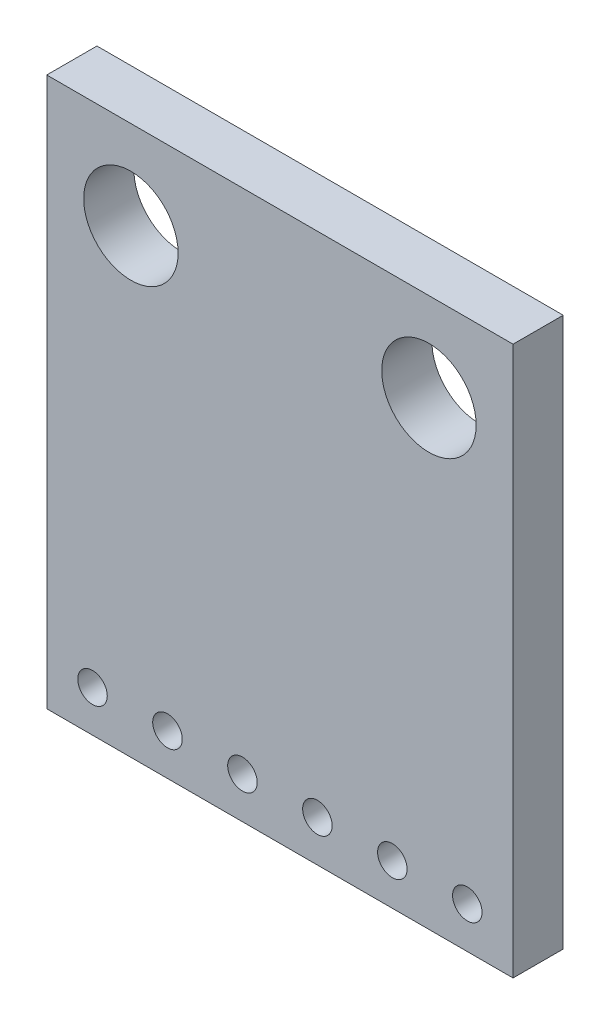
ISO-10303-21;
HEADER;
FILE_DESCRIPTION(('STEP AP214'),'2;1');
FILE_NAME('part.step','',(''),(''),'','','');
FILE_SCHEMA(('AUTOMOTIVE_DESIGN { 1 0 10303 214 1 1 1 1 }'));
ENDSEC;
DATA;
#1=APPLICATION_CONTEXT('core data for automotive mechanical design processes');
#2=APPLICATION_PROTOCOL_DEFINITION('international standard','automotive_design',2000,#1);
#3=PRODUCT_CONTEXT('',#1,'mechanical');
#4=PRODUCT('Part','Part','',(#3));
#5=PRODUCT_RELATED_PRODUCT_CATEGORY('part','',(#4));
#6=PRODUCT_DEFINITION_FORMATION('','',#4);
#7=PRODUCT_DEFINITION_CONTEXT('part definition',#1,'design');
#8=PRODUCT_DEFINITION('design','',#6,#7);
#9=PRODUCT_DEFINITION_SHAPE('','',#8);
#10=(LENGTH_UNIT() NAMED_UNIT(*) SI_UNIT(.MILLI.,.METRE.));
#11=(NAMED_UNIT(*) PLANE_ANGLE_UNIT() SI_UNIT($,.RADIAN.));
#12=(NAMED_UNIT(*) SI_UNIT($,.STERADIAN.) SOLID_ANGLE_UNIT());
#13=UNCERTAINTY_MEASURE_WITH_UNIT(LENGTH_MEASURE(1.E-05),#10,'distance_accuracy_value','');
#14=(GEOMETRIC_REPRESENTATION_CONTEXT(3) GLOBAL_UNCERTAINTY_ASSIGNED_CONTEXT((#13)) GLOBAL_UNIT_ASSIGNED_CONTEXT((#10,
#11,#12)) REPRESENTATION_CONTEXT('',''));
#15=CARTESIAN_POINT('',(0.,0.,0.));
#16=DIRECTION('',(0.,0.,1.));
#17=DIRECTION('',(1.,0.,0.));
#18=AXIS2_PLACEMENT_3D('',#15,#16,#17);
#19=CARTESIAN_POINT('',(0.,0.,1.7));
#20=DIRECTION('',(0.,0.,1.));
#21=DIRECTION('',(1.,0.,0.));
#22=AXIS2_PLACEMENT_3D('',#19,#20,#21);
#23=PLANE('',#22);
#24=CARTESIAN_POINT('',(3.81,-7.9,1.7));
#25=DIRECTION('',(0.,0.,1.));
#26=DIRECTION('',(1.,0.,0.));
#27=AXIS2_PLACEMENT_3D('',#24,#25,#26);
#28=CIRCLE('',#27,0.500000000000001);
#29=CARTESIAN_POINT('',(4.31,-7.9,1.7));
#30=VERTEX_POINT('',#29);
#31=EDGE_CURVE('E151',#30,#30,#28,.T.);
#32=ORIENTED_EDGE('',*,*,#31,.F.);
#33=EDGE_LOOP('',(#32));
#34=FACE_BOUND('',#33,.T.);
#35=CARTESIAN_POINT('',(-1.27,-7.9,1.7));
#36=DIRECTION('',(0.,0.,1.));
#37=DIRECTION('',(1.,0.,0.));
#38=AXIS2_PLACEMENT_3D('',#35,#36,#37);
#39=CIRCLE('',#38,0.500000000000001);
#40=CARTESIAN_POINT('',(-0.769999999999999,-7.9,1.7));
#41=VERTEX_POINT('',#40);
#42=EDGE_CURVE('E139',#41,#41,#39,.T.);
#43=ORIENTED_EDGE('',*,*,#42,.F.);
#44=EDGE_LOOP('',(#43));
#45=FACE_BOUND('',#44,.T.);
#46=CARTESIAN_POINT('',(-6.35,-7.9,1.7));
#47=DIRECTION('',(0.,0.,1.));
#48=DIRECTION('',(1.,0.,0.));
#49=AXIS2_PLACEMENT_3D('',#46,#47,#48);
#50=CIRCLE('',#49,0.500000000000001);
#51=CARTESIAN_POINT('',(-5.85,-7.9,1.7));
#52=VERTEX_POINT('',#51);
#53=EDGE_CURVE('E127',#52,#52,#50,.T.);
#54=ORIENTED_EDGE('',*,*,#53,.F.);
#55=EDGE_LOOP('',(#54));
#56=FACE_BOUND('',#55,.T.);
#57=CARTESIAN_POINT('',(-5.05,6.3,1.7));
#58=DIRECTION('',(0.,0.,1.));
#59=DIRECTION('',(1.,0.,0.));
#60=AXIS2_PLACEMENT_3D('',#57,#58,#59);
#61=CIRCLE('',#60,1.6);
#62=CARTESIAN_POINT('',(-3.45,6.3,1.7));
#63=VERTEX_POINT('',#62);
#64=EDGE_CURVE('E106',#63,#63,#61,.T.);
#65=ORIENTED_EDGE('',*,*,#64,.F.);
#66=EDGE_LOOP('',(#65));
#67=FACE_BOUND('',#66,.T.);
#68=DIRECTION('',(0.,1.,0.));
#69=VECTOR('',#68,1.);
#70=CARTESIAN_POINT('',(7.9,9.3,1.7));
#71=LINE('',#70,#69);
#72=CARTESIAN_POINT('',(7.9,-9.3,1.7));
#73=VERTEX_POINT('',#72);
#74=CARTESIAN_POINT('',(7.9,9.3,1.7));
#75=VERTEX_POINT('',#74);
#76=EDGE_CURVE('E91',#73,#75,#71,.T.);
#77=ORIENTED_EDGE('',*,*,#76,.T.);
#78=DIRECTION('',(-1.,0.,0.));
#79=VECTOR('',#78,1.);
#80=CARTESIAN_POINT('',(-7.9,9.3,1.7));
#81=LINE('',#80,#79);
#82=CARTESIAN_POINT('',(-7.9,9.3,1.7));
#83=VERTEX_POINT('',#82);
#84=EDGE_CURVE('E86',#75,#83,#81,.T.);
#85=ORIENTED_EDGE('',*,*,#84,.T.);
#86=DIRECTION('',(0.,-1.,0.));
#87=VECTOR('',#86,1.);
#88=CARTESIAN_POINT('',(-7.9,9.3,1.7));
#89=LINE('',#88,#87);
#90=CARTESIAN_POINT('',(-7.9,-9.3,1.7));
#91=VERTEX_POINT('',#90);
#92=EDGE_CURVE('E89',#83,#91,#89,.T.);
#93=ORIENTED_EDGE('',*,*,#92,.T.);
#94=DIRECTION('',(1.,0.,0.));
#95=VECTOR('',#94,1.);
#96=CARTESIAN_POINT('',(-7.9,-9.3,1.7));
#97=LINE('',#96,#95);
#98=EDGE_CURVE('E56',#91,#73,#97,.T.);
#99=ORIENTED_EDGE('',*,*,#98,.T.);
#100=EDGE_LOOP('',(#77,#85,#93,#99));
#101=FACE_BOUND('',#100,.T.);
#102=CARTESIAN_POINT('',(5.05,6.3,1.7));
#103=DIRECTION('',(0.,0.,1.));
#104=DIRECTION('',(1.,0.,0.));
#105=AXIS2_PLACEMENT_3D('',#102,#103,#104);
#106=CIRCLE('',#105,1.6);
#107=CARTESIAN_POINT('',(6.65,6.3,1.7));
#108=VERTEX_POINT('',#107);
#109=EDGE_CURVE('E121',#108,#108,#106,.T.);
#110=ORIENTED_EDGE('',*,*,#109,.F.);
#111=EDGE_LOOP('',(#110));
#112=FACE_BOUND('',#111,.T.);
#113=CARTESIAN_POINT('',(-3.81,-7.9,1.7));
#114=DIRECTION('',(0.,0.,1.));
#115=DIRECTION('',(1.,0.,0.));
#116=AXIS2_PLACEMENT_3D('',#113,#114,#115);
#117=CIRCLE('',#116,0.500000000000001);
#118=CARTESIAN_POINT('',(-3.31,-7.9,1.7));
#119=VERTEX_POINT('',#118);
#120=EDGE_CURVE('E133',#119,#119,#117,.T.);
#121=ORIENTED_EDGE('',*,*,#120,.F.);
#122=EDGE_LOOP('',(#121));
#123=FACE_BOUND('',#122,.T.);
#124=CARTESIAN_POINT('',(1.27,-7.9,1.7));
#125=DIRECTION('',(0.,0.,1.));
#126=DIRECTION('',(1.,0.,0.));
#127=AXIS2_PLACEMENT_3D('',#124,#125,#126);
#128=CIRCLE('',#127,0.500000000000001);
#129=CARTESIAN_POINT('',(1.77,-7.9,1.7));
#130=VERTEX_POINT('',#129);
#131=EDGE_CURVE('E145',#130,#130,#128,.T.);
#132=ORIENTED_EDGE('',*,*,#131,.F.);
#133=EDGE_LOOP('',(#132));
#134=FACE_BOUND('',#133,.T.);
#135=CARTESIAN_POINT('',(6.35,-7.9,1.7));
#136=DIRECTION('',(0.,0.,1.));
#137=DIRECTION('',(1.,0.,0.));
#138=AXIS2_PLACEMENT_3D('',#135,#136,#137);
#139=CIRCLE('',#138,0.500000000000001);
#140=CARTESIAN_POINT('',(6.85,-7.9,1.7));
#141=VERTEX_POINT('',#140);
#142=EDGE_CURVE('E157',#141,#141,#139,.T.);
#143=ORIENTED_EDGE('',*,*,#142,.F.);
#144=EDGE_LOOP('',(#143));
#145=FACE_BOUND('',#144,.T.);
#146=ADVANCED_FACE('F39',(#34,#45,#56,#67,#101,#112,#123,#134,#145),#23,.T.);
#147=CARTESIAN_POINT('',(0.,0.,0.));
#148=DIRECTION('',(0.,0.,1.));
#149=DIRECTION('',(1.,0.,0.));
#150=AXIS2_PLACEMENT_3D('',#147,#148,#149);
#151=PLANE('',#150);
#152=DIRECTION('',(0.,1.,0.));
#153=VECTOR('',#152,1.);
#154=CARTESIAN_POINT('',(7.9,9.3,0.));
#155=LINE('',#154,#153);
#156=CARTESIAN_POINT('',(7.9,-9.3,0.));
#157=VERTEX_POINT('',#156);
#158=CARTESIAN_POINT('',(7.9,9.3,0.));
#159=VERTEX_POINT('',#158);
#160=EDGE_CURVE('E103',#157,#159,#155,.T.);
#161=ORIENTED_EDGE('',*,*,#160,.F.);
#162=DIRECTION('',(1.,0.,0.));
#163=VECTOR('',#162,1.);
#164=CARTESIAN_POINT('',(-7.9,-9.3,0.));
#165=LINE('',#164,#163);
#166=CARTESIAN_POINT('',(-7.9,-9.3,0.));
#167=VERTEX_POINT('',#166);
#168=EDGE_CURVE('E79',#167,#157,#165,.T.);
#169=ORIENTED_EDGE('',*,*,#168,.F.);
#170=DIRECTION('',(0.,-1.,0.));
#171=VECTOR('',#170,1.);
#172=CARTESIAN_POINT('',(-7.9,9.3,0.));
#173=LINE('',#172,#171);
#174=CARTESIAN_POINT('',(-7.9,9.3,0.));
#175=VERTEX_POINT('',#174);
#176=EDGE_CURVE('E73',#175,#167,#173,.T.);
#177=ORIENTED_EDGE('',*,*,#176,.F.);
#178=DIRECTION('',(-1.,0.,0.));
#179=VECTOR('',#178,1.);
#180=CARTESIAN_POINT('',(-7.9,9.3,0.));
#181=LINE('',#180,#179);
#182=EDGE_CURVE('E95',#159,#175,#181,.T.);
#183=ORIENTED_EDGE('',*,*,#182,.F.);
#184=EDGE_LOOP('',(#161,#169,#177,#183));
#185=FACE_BOUND('',#184,.T.);
#186=CARTESIAN_POINT('',(-5.05,6.3,0.));
#187=DIRECTION('',(0.,0.,1.));
#188=DIRECTION('',(1.,0.,0.));
#189=AXIS2_PLACEMENT_3D('',#186,#187,#188);
#190=CIRCLE('',#189,1.6);
#191=CARTESIAN_POINT('',(-3.45,6.3,0.));
#192=VERTEX_POINT('',#191);
#193=EDGE_CURVE('E118',#192,#192,#190,.T.);
#194=ORIENTED_EDGE('',*,*,#193,.T.);
#195=EDGE_LOOP('',(#194));
#196=FACE_BOUND('',#195,.T.);
#197=CARTESIAN_POINT('',(5.05,6.3,0.));
#198=DIRECTION('',(0.,0.,1.));
#199=DIRECTION('',(1.,0.,0.));
#200=AXIS2_PLACEMENT_3D('',#197,#198,#199);
#201=CIRCLE('',#200,1.6);
#202=CARTESIAN_POINT('',(6.65,6.3,0.));
#203=VERTEX_POINT('',#202);
#204=EDGE_CURVE('E124',#203,#203,#201,.T.);
#205=ORIENTED_EDGE('',*,*,#204,.T.);
#206=EDGE_LOOP('',(#205));
#207=FACE_BOUND('',#206,.T.);
#208=CARTESIAN_POINT('',(-6.35,-7.9,0.));
#209=DIRECTION('',(0.,0.,1.));
#210=DIRECTION('',(1.,0.,0.));
#211=AXIS2_PLACEMENT_3D('',#208,#209,#210);
#212=CIRCLE('',#211,0.500000000000001);
#213=CARTESIAN_POINT('',(-5.85,-7.9,0.));
#214=VERTEX_POINT('',#213);
#215=EDGE_CURVE('E130',#214,#214,#212,.T.);
#216=ORIENTED_EDGE('',*,*,#215,.T.);
#217=EDGE_LOOP('',(#216));
#218=FACE_BOUND('',#217,.T.);
#219=CARTESIAN_POINT('',(-3.81,-7.9,0.));
#220=DIRECTION('',(0.,0.,1.));
#221=DIRECTION('',(1.,0.,0.));
#222=AXIS2_PLACEMENT_3D('',#219,#220,#221);
#223=CIRCLE('',#222,0.500000000000001);
#224=CARTESIAN_POINT('',(-3.31,-7.9,0.));
#225=VERTEX_POINT('',#224);
#226=EDGE_CURVE('E136',#225,#225,#223,.T.);
#227=ORIENTED_EDGE('',*,*,#226,.T.);
#228=EDGE_LOOP('',(#227));
#229=FACE_BOUND('',#228,.T.);
#230=CARTESIAN_POINT('',(-1.27,-7.9,0.));
#231=DIRECTION('',(0.,0.,1.));
#232=DIRECTION('',(1.,0.,0.));
#233=AXIS2_PLACEMENT_3D('',#230,#231,#232);
#234=CIRCLE('',#233,0.500000000000001);
#235=CARTESIAN_POINT('',(-0.769999999999999,-7.9,0.));
#236=VERTEX_POINT('',#235);
#237=EDGE_CURVE('E142',#236,#236,#234,.T.);
#238=ORIENTED_EDGE('',*,*,#237,.T.);
#239=EDGE_LOOP('',(#238));
#240=FACE_BOUND('',#239,.T.);
#241=CARTESIAN_POINT('',(1.27,-7.9,0.));
#242=DIRECTION('',(0.,0.,1.));
#243=DIRECTION('',(1.,0.,0.));
#244=AXIS2_PLACEMENT_3D('',#241,#242,#243);
#245=CIRCLE('',#244,0.500000000000001);
#246=CARTESIAN_POINT('',(1.77,-7.9,0.));
#247=VERTEX_POINT('',#246);
#248=EDGE_CURVE('E148',#247,#247,#245,.T.);
#249=ORIENTED_EDGE('',*,*,#248,.T.);
#250=EDGE_LOOP('',(#249));
#251=FACE_BOUND('',#250,.T.);
#252=CARTESIAN_POINT('',(3.81,-7.9,0.));
#253=DIRECTION('',(0.,0.,1.));
#254=DIRECTION('',(1.,0.,0.));
#255=AXIS2_PLACEMENT_3D('',#252,#253,#254);
#256=CIRCLE('',#255,0.500000000000001);
#257=CARTESIAN_POINT('',(4.31,-7.9,0.));
#258=VERTEX_POINT('',#257);
#259=EDGE_CURVE('E154',#258,#258,#256,.T.);
#260=ORIENTED_EDGE('',*,*,#259,.T.);
#261=EDGE_LOOP('',(#260));
#262=FACE_BOUND('',#261,.T.);
#263=CARTESIAN_POINT('',(6.35,-7.9,0.));
#264=DIRECTION('',(0.,0.,1.));
#265=DIRECTION('',(1.,0.,0.));
#266=AXIS2_PLACEMENT_3D('',#263,#264,#265);
#267=CIRCLE('',#266,0.500000000000001);
#268=CARTESIAN_POINT('',(6.85,-7.9,0.));
#269=VERTEX_POINT('',#268);
#270=EDGE_CURVE('E160',#269,#269,#267,.T.);
#271=ORIENTED_EDGE('',*,*,#270,.T.);
#272=EDGE_LOOP('',(#271));
#273=FACE_BOUND('',#272,.T.);
#274=ADVANCED_FACE('F114',(#185,#196,#207,#218,#229,#240,#251,#262,#273),#151,.F.);
#275=CARTESIAN_POINT('',(7.9,9.3,1.7));
#276=DIRECTION('',(-1.,0.,0.));
#277=DIRECTION('',(0.,0.,1.));
#278=AXIS2_PLACEMENT_3D('',#275,#276,#277);
#279=PLANE('',#278);
#280=ORIENTED_EDGE('',*,*,#160,.T.);
#281=DIRECTION('',(0.,0.,-1.));
#282=VECTOR('',#281,1.);
#283=CARTESIAN_POINT('',(7.9,9.3,1.7));
#284=LINE('',#283,#282);
#285=EDGE_CURVE('E11',#75,#159,#284,.T.);
#286=ORIENTED_EDGE('',*,*,#285,.F.);
#287=ORIENTED_EDGE('',*,*,#76,.F.);
#288=DIRECTION('',(0.,0.,-1.));
#289=VECTOR('',#288,1.);
#290=CARTESIAN_POINT('',(7.9,-9.3,1.7));
#291=LINE('',#290,#289);
#292=EDGE_CURVE('E99',#73,#157,#291,.T.);
#293=ORIENTED_EDGE('',*,*,#292,.T.);
#294=EDGE_LOOP('',(#280,#286,#287,#293));
#295=FACE_BOUND('',#294,.T.);
#296=ADVANCED_FACE('F41',(#295),#279,.F.);
#297=CARTESIAN_POINT('',(-7.9,9.3,1.7));
#298=DIRECTION('',(0.,-1.,0.));
#299=DIRECTION('',(0.,0.,-1.));
#300=AXIS2_PLACEMENT_3D('',#297,#298,#299);
#301=PLANE('',#300);
#302=ORIENTED_EDGE('',*,*,#182,.T.);
#303=DIRECTION('',(0.,0.,-1.));
#304=VECTOR('',#303,1.);
#305=CARTESIAN_POINT('',(-7.9,9.3,1.7));
#306=LINE('',#305,#304);
#307=EDGE_CURVE('E48',#83,#175,#306,.T.);
#308=ORIENTED_EDGE('',*,*,#307,.F.);
#309=ORIENTED_EDGE('',*,*,#84,.F.);
#310=ORIENTED_EDGE('',*,*,#285,.T.);
#311=EDGE_LOOP('',(#302,#308,#309,#310));
#312=FACE_BOUND('',#311,.T.);
#313=ADVANCED_FACE('F94',(#312),#301,.F.);
#314=CARTESIAN_POINT('',(-7.9,9.3,1.7));
#315=DIRECTION('',(1.,0.,0.));
#316=DIRECTION('',(0.,0.,-1.));
#317=AXIS2_PLACEMENT_3D('',#314,#315,#316);
#318=PLANE('',#317);
#319=ORIENTED_EDGE('',*,*,#176,.T.);
#320=DIRECTION('',(0.,0.,-1.));
#321=VECTOR('',#320,1.);
#322=CARTESIAN_POINT('',(-7.9,-9.3,1.7));
#323=LINE('',#322,#321);
#324=EDGE_CURVE('E96',#91,#167,#323,.T.);
#325=ORIENTED_EDGE('',*,*,#324,.F.);
#326=ORIENTED_EDGE('',*,*,#92,.F.);
#327=ORIENTED_EDGE('',*,*,#307,.T.);
#328=EDGE_LOOP('',(#319,#325,#326,#327));
#329=FACE_BOUND('',#328,.T.);
#330=ADVANCED_FACE('F97',(#329),#318,.F.);
#331=CARTESIAN_POINT('',(-7.9,-9.3,1.7));
#332=DIRECTION('',(0.,1.,0.));
#333=DIRECTION('',(0.,0.,1.));
#334=AXIS2_PLACEMENT_3D('',#331,#332,#333);
#335=PLANE('',#334);
#336=ORIENTED_EDGE('',*,*,#168,.T.);
#337=ORIENTED_EDGE('',*,*,#292,.F.);
#338=ORIENTED_EDGE('',*,*,#98,.F.);
#339=ORIENTED_EDGE('',*,*,#324,.T.);
#340=EDGE_LOOP('',(#336,#337,#338,#339));
#341=FACE_BOUND('',#340,.T.);
#342=ADVANCED_FACE('F111',(#341),#335,.F.);
#343=CARTESIAN_POINT('',(-5.05,6.3,1.7));
#344=DIRECTION('',(0.,0.,-1.));
#345=DIRECTION('',(-1.,0.,0.));
#346=AXIS2_PLACEMENT_3D('',#343,#344,#345);
#347=CYLINDRICAL_SURFACE('',#346,1.6);
#348=ORIENTED_EDGE('',*,*,#64,.T.);
#349=EDGE_LOOP('',(#348));
#350=FACE_BOUND('',#349,.T.);
#351=ORIENTED_EDGE('',*,*,#193,.F.);
#352=EDGE_LOOP('',(#351));
#353=FACE_BOUND('',#352,.T.);
#354=ADVANCED_FACE('F179',(#350,#353),#347,.F.);
#355=CARTESIAN_POINT('',(5.05,6.3,1.7));
#356=DIRECTION('',(0.,0.,-1.));
#357=DIRECTION('',(-1.,0.,0.));
#358=AXIS2_PLACEMENT_3D('',#355,#356,#357);
#359=CYLINDRICAL_SURFACE('',#358,1.6);
#360=ORIENTED_EDGE('',*,*,#109,.T.);
#361=EDGE_LOOP('',(#360));
#362=FACE_BOUND('',#361,.T.);
#363=ORIENTED_EDGE('',*,*,#204,.F.);
#364=EDGE_LOOP('',(#363));
#365=FACE_BOUND('',#364,.T.);
#366=ADVANCED_FACE('F247',(#362,#365),#359,.F.);
#367=CARTESIAN_POINT('',(-6.35,-7.9,1.7));
#368=DIRECTION('',(0.,0.,-1.));
#369=DIRECTION('',(-1.,0.,0.));
#370=AXIS2_PLACEMENT_3D('',#367,#368,#369);
#371=CYLINDRICAL_SURFACE('',#370,0.500000000000001);
#372=ORIENTED_EDGE('',*,*,#53,.T.);
#373=EDGE_LOOP('',(#372));
#374=FACE_BOUND('',#373,.T.);
#375=ORIENTED_EDGE('',*,*,#215,.F.);
#376=EDGE_LOOP('',(#375));
#377=FACE_BOUND('',#376,.T.);
#378=ADVANCED_FACE('F258',(#374,#377),#371,.F.);
#379=CARTESIAN_POINT('',(-3.81,-7.9,1.7));
#380=DIRECTION('',(0.,0.,-1.));
#381=DIRECTION('',(-1.,0.,0.));
#382=AXIS2_PLACEMENT_3D('',#379,#380,#381);
#383=CYLINDRICAL_SURFACE('',#382,0.500000000000001);
#384=ORIENTED_EDGE('',*,*,#120,.T.);
#385=EDGE_LOOP('',(#384));
#386=FACE_BOUND('',#385,.T.);
#387=ORIENTED_EDGE('',*,*,#226,.F.);
#388=EDGE_LOOP('',(#387));
#389=FACE_BOUND('',#388,.T.);
#390=ADVANCED_FACE('F269',(#386,#389),#383,.F.);
#391=CARTESIAN_POINT('',(-1.27,-7.9,1.7));
#392=DIRECTION('',(0.,0.,-1.));
#393=DIRECTION('',(-1.,0.,0.));
#394=AXIS2_PLACEMENT_3D('',#391,#392,#393);
#395=CYLINDRICAL_SURFACE('',#394,0.500000000000001);
#396=ORIENTED_EDGE('',*,*,#42,.T.);
#397=EDGE_LOOP('',(#396));
#398=FACE_BOUND('',#397,.T.);
#399=ORIENTED_EDGE('',*,*,#237,.F.);
#400=EDGE_LOOP('',(#399));
#401=FACE_BOUND('',#400,.T.);
#402=ADVANCED_FACE('F281',(#398,#401),#395,.F.);
#403=CARTESIAN_POINT('',(1.27,-7.9,1.7));
#404=DIRECTION('',(0.,0.,-1.));
#405=DIRECTION('',(-1.,0.,0.));
#406=AXIS2_PLACEMENT_3D('',#403,#404,#405);
#407=CYLINDRICAL_SURFACE('',#406,0.500000000000001);
#408=ORIENTED_EDGE('',*,*,#131,.T.);
#409=EDGE_LOOP('',(#408));
#410=FACE_BOUND('',#409,.T.);
#411=ORIENTED_EDGE('',*,*,#248,.F.);
#412=EDGE_LOOP('',(#411));
#413=FACE_BOUND('',#412,.T.);
#414=ADVANCED_FACE('F293',(#410,#413),#407,.F.);
#415=CARTESIAN_POINT('',(3.81,-7.9,1.7));
#416=DIRECTION('',(0.,0.,-1.));
#417=DIRECTION('',(-1.,0.,0.));
#418=AXIS2_PLACEMENT_3D('',#415,#416,#417);
#419=CYLINDRICAL_SURFACE('',#418,0.500000000000001);
#420=ORIENTED_EDGE('',*,*,#31,.T.);
#421=EDGE_LOOP('',(#420));
#422=FACE_BOUND('',#421,.T.);
#423=ORIENTED_EDGE('',*,*,#259,.F.);
#424=EDGE_LOOP('',(#423));
#425=FACE_BOUND('',#424,.T.);
#426=ADVANCED_FACE('F305',(#422,#425),#419,.F.);
#427=CARTESIAN_POINT('',(6.35,-7.9,1.7));
#428=DIRECTION('',(0.,0.,-1.));
#429=DIRECTION('',(-1.,0.,0.));
#430=AXIS2_PLACEMENT_3D('',#427,#428,#429);
#431=CYLINDRICAL_SURFACE('',#430,0.500000000000001);
#432=ORIENTED_EDGE('',*,*,#142,.T.);
#433=EDGE_LOOP('',(#432));
#434=FACE_BOUND('',#433,.T.);
#435=ORIENTED_EDGE('',*,*,#270,.F.);
#436=EDGE_LOOP('',(#435));
#437=FACE_BOUND('',#436,.T.);
#438=ADVANCED_FACE('F166',(#434,#437),#431,.F.);
#439=CLOSED_SHELL('',(#146,#274,#296,#313,#330,#342,#354,#366,#378,#390,#402,#414,#426,#438));
#440=MANIFOLD_SOLID_BREP('B2',#439);
#441=ADVANCED_BREP_SHAPE_REPRESENTATION('',(#18,#440),#14);
#442=SHAPE_DEFINITION_REPRESENTATION(#9,#441);
ENDSEC;
END-ISO-10303-21;
